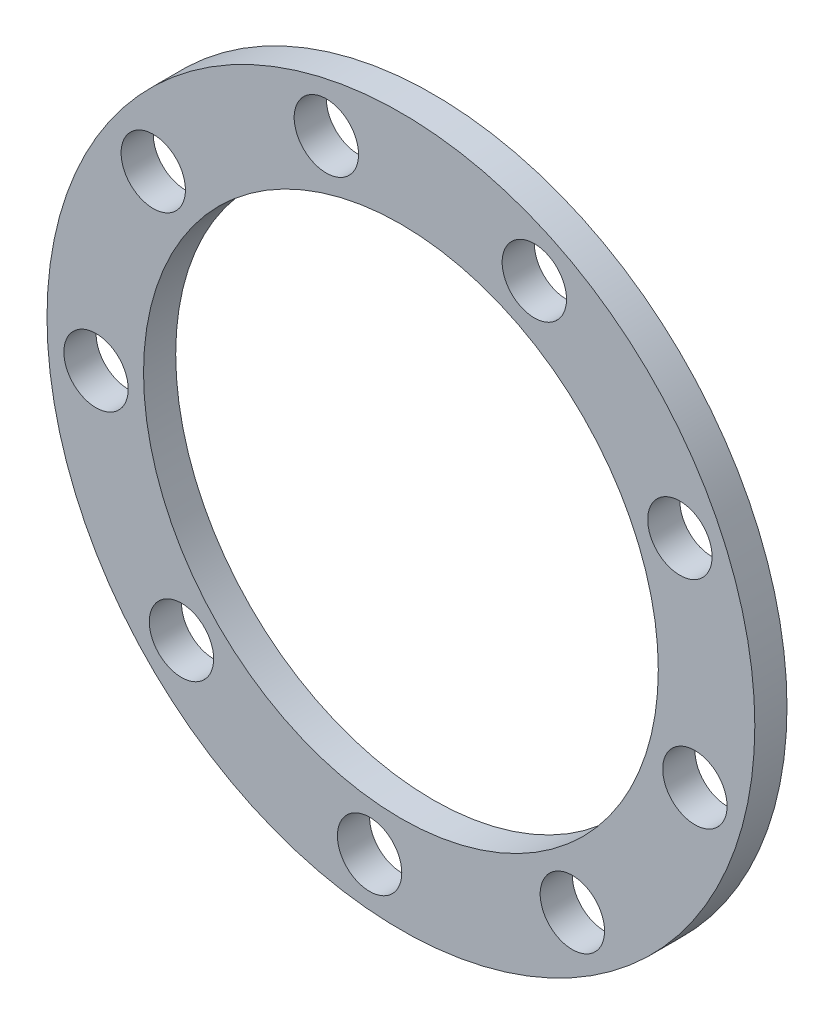
ISO-10303-21;
HEADER;
FILE_DESCRIPTION(('STEP AP214'),'2;1');
FILE_NAME('part.step','',(''),(''),'','','');
FILE_SCHEMA(('AUTOMOTIVE_DESIGN { 1 0 10303 214 1 1 1 1 }'));
ENDSEC;
DATA;
#1=APPLICATION_CONTEXT('core data for automotive mechanical design processes');
#2=APPLICATION_PROTOCOL_DEFINITION('international standard','automotive_design',2000,#1);
#3=PRODUCT_CONTEXT('',#1,'mechanical');
#4=PRODUCT('Part','Part','',(#3));
#5=PRODUCT_RELATED_PRODUCT_CATEGORY('part','',(#4));
#6=PRODUCT_DEFINITION_FORMATION('','',#4);
#7=PRODUCT_DEFINITION_CONTEXT('part definition',#1,'design');
#8=PRODUCT_DEFINITION('design','',#6,#7);
#9=PRODUCT_DEFINITION_SHAPE('','',#8);
#10=(LENGTH_UNIT() NAMED_UNIT(*) SI_UNIT(.MILLI.,.METRE.));
#11=(NAMED_UNIT(*) PLANE_ANGLE_UNIT() SI_UNIT($,.RADIAN.));
#12=(NAMED_UNIT(*) SI_UNIT($,.STERADIAN.) SOLID_ANGLE_UNIT());
#13=UNCERTAINTY_MEASURE_WITH_UNIT(LENGTH_MEASURE(1.E-05),#10,'distance_accuracy_value','');
#14=(GEOMETRIC_REPRESENTATION_CONTEXT(3) GLOBAL_UNCERTAINTY_ASSIGNED_CONTEXT((#13)) GLOBAL_UNIT_ASSIGNED_CONTEXT((#10,
#11,#12)) REPRESENTATION_CONTEXT('',''));
#15=CARTESIAN_POINT('',(0.,0.,0.));
#16=DIRECTION('',(0.,0.,1.));
#17=DIRECTION('',(1.,0.,0.));
#18=AXIS2_PLACEMENT_3D('',#15,#16,#17);
#19=CARTESIAN_POINT('',(0.,0.,1.));
#20=DIRECTION('',(0.,0.,1.));
#21=DIRECTION('',(1.,0.,0.));
#22=AXIS2_PLACEMENT_3D('',#19,#20,#21);
#23=PLANE('',#22);
#24=CARTESIAN_POINT('',(-9.47547630305742,-0.682164811595904,1.));
#25=DIRECTION('',(0.,0.,1.));
#26=DIRECTION('',(1.,0.,0.));
#27=AXIS2_PLACEMENT_3D('',#24,#25,#26);
#28=CIRCLE('',#27,1.00000000000093);
#29=CARTESIAN_POINT('',(-8.47547630305649,-0.682164811595904,1.));
#30=VERTEX_POINT('',#29);
#31=EDGE_CURVE('E91',#30,#30,#28,.T.);
#32=ORIENTED_EDGE('',*,*,#31,.F.);
#33=EDGE_LOOP('',(#32));
#34=FACE_BOUND('',#33,.T.);
#35=CARTESIAN_POINT('',(-0.973597997259366,-9.44997920313724,1.));
#36=DIRECTION('',(0.,0.,1.));
#37=DIRECTION('',(1.,0.,0.));
#38=AXIS2_PLACEMENT_3D('',#35,#36,#37);
#39=CIRCLE('',#38,1.00000000000192);
#40=CARTESIAN_POINT('',(0.0264020027425509,-9.44997920313724,1.));
#41=VERTEX_POINT('',#40);
#42=EDGE_CURVE('E79',#41,#41,#39,.T.);
#43=ORIENTED_EDGE('',*,*,#42,.F.);
#44=EDGE_LOOP('',(#43));
#45=FACE_BOUND('',#44,.T.);
#46=CARTESIAN_POINT('',(9.13734926705041,-2.59977852363407,1.));
#47=DIRECTION('',(0.,0.,1.));
#48=DIRECTION('',(1.,0.,0.));
#49=AXIS2_PLACEMENT_3D('',#46,#47,#48);
#50=CIRCLE('',#49,1.00000000000142);
#51=CARTESIAN_POINT('',(10.1373492670518,-2.59977852363407,1.));
#52=VERTEX_POINT('',#51);
#53=EDGE_CURVE('E67',#52,#52,#50,.T.);
#54=ORIENTED_EDGE('',*,*,#53,.F.);
#55=EDGE_LOOP('',(#54));
#56=FACE_BOUND('',#55,.T.);
#57=CARTESIAN_POINT('',(4.14696609512001,8.54708559720427,1.));
#58=DIRECTION('',(0.,0.,1.));
#59=DIRECTION('',(1.,0.,0.));
#60=AXIS2_PLACEMENT_3D('',#57,#58,#59);
#61=CIRCLE('',#60,1.0000000000002);
#62=CARTESIAN_POINT('',(5.14696609512021,8.54708559720427,1.));
#63=VERTEX_POINT('',#62);
#64=EDGE_CURVE('E55',#63,#63,#61,.T.);
#65=ORIENTED_EDGE('',*,*,#64,.F.);
#66=EDGE_LOOP('',(#65));
#67=FACE_BOUND('',#66,.T.);
#68=CARTESIAN_POINT('',(0.,0.,1.));
#69=DIRECTION('',(0.,0.,1.));
#70=DIRECTION('',(1.,0.,0.));
#71=AXIS2_PLACEMENT_3D('',#68,#69,#70);
#72=CIRCLE('',#71,8.);
#73=CARTESIAN_POINT('',(8.,0.,1.));
#74=VERTEX_POINT('',#73);
#75=EDGE_CURVE('E44',#74,#74,#72,.T.);
#76=ORIENTED_EDGE('',*,*,#75,.F.);
#77=EDGE_LOOP('',(#76));
#78=FACE_BOUND('',#77,.T.);
#79=CARTESIAN_POINT('',(0.,0.,1.));
#80=DIRECTION('',(0.,0.,1.));
#81=DIRECTION('',(1.,0.,0.));
#82=AXIS2_PLACEMENT_3D('',#79,#80,#81);
#83=CIRCLE('',#82,11.);
#84=CARTESIAN_POINT('',(11.,0.,1.));
#85=VERTEX_POINT('',#84);
#86=EDGE_CURVE('E10',#85,#85,#83,.T.);
#87=ORIENTED_EDGE('',*,*,#86,.T.);
#88=EDGE_LOOP('',(#87));
#89=FACE_BOUND('',#88,.T.);
#90=CARTESIAN_POINT('',(-2.31720038784333,9.21306585033336,1.));
#91=DIRECTION('',(0.,0.,1.));
#92=DIRECTION('',(1.,0.,0.));
#93=AXIS2_PLACEMENT_3D('',#90,#91,#92);
#94=CIRCLE('',#93,1.);
#95=CARTESIAN_POINT('',(-1.31720038784333,9.21306585033336,1.));
#96=VERTEX_POINT('',#95);
#97=EDGE_CURVE('E49',#96,#96,#94,.T.);
#98=ORIENTED_EDGE('',*,*,#97,.F.);
#99=EDGE_LOOP('',(#98));
#100=FACE_BOUND('',#99,.T.);
#101=CARTESIAN_POINT('',(8.67072105378274,3.88182900286791,1.));
#102=DIRECTION('',(0.,0.,1.));
#103=DIRECTION('',(1.,0.,0.));
#104=AXIS2_PLACEMENT_3D('',#101,#102,#103);
#105=CIRCLE('',#104,1.00000000000076);
#106=CARTESIAN_POINT('',(9.6707210537835,3.88182900286791,1.));
#107=VERTEX_POINT('',#106);
#108=EDGE_CURVE('E61',#107,#107,#105,.T.);
#109=ORIENTED_EDGE('',*,*,#108,.F.);
#110=EDGE_LOOP('',(#109));
#111=FACE_BOUND('',#110,.T.);
#112=CARTESIAN_POINT('',(5.32851020794016,-7.86492078560768,1.));
#113=DIRECTION('',(0.,0.,1.));
#114=DIRECTION('',(1.,0.,0.));
#115=AXIS2_PLACEMENT_3D('',#112,#113,#114);
#116=CIRCLE('',#115,1.00000000000187);
#117=CARTESIAN_POINT('',(6.32851020794203,-7.86492078560768,1.));
#118=VERTEX_POINT('',#117);
#119=EDGE_CURVE('E73',#118,#118,#116,.T.);
#120=ORIENTED_EDGE('',*,*,#119,.F.);
#121=EDGE_LOOP('',(#120));
#122=FACE_BOUND('',#121,.T.);
#123=CARTESIAN_POINT('',(-6.82014887920433,-6.61328732669861,1.));
#124=DIRECTION('',(0.,0.,1.));
#125=DIRECTION('',(1.,0.,0.));
#126=AXIS2_PLACEMENT_3D('',#123,#124,#125);
#127=CIRCLE('',#126,1.00000000000155);
#128=CARTESIAN_POINT('',(-5.82014887920278,-6.61328732669861,1.));
#129=VERTEX_POINT('',#128);
#130=EDGE_CURVE('E85',#129,#129,#127,.T.);
#131=ORIENTED_EDGE('',*,*,#130,.F.);
#132=EDGE_LOOP('',(#131));
#133=FACE_BOUND('',#132,.T.);
#134=CARTESIAN_POINT('',(-7.69712305652062,5.56815020027002,1.));
#135=DIRECTION('',(0.,0.,1.));
#136=DIRECTION('',(1.,0.,0.));
#137=AXIS2_PLACEMENT_3D('',#134,#135,#136);
#138=CIRCLE('',#137,1.00000000000037);
#139=CARTESIAN_POINT('',(-6.69712305652025,5.56815020027002,1.));
#140=VERTEX_POINT('',#139);
#141=EDGE_CURVE('E97',#140,#140,#138,.T.);
#142=ORIENTED_EDGE('',*,*,#141,.F.);
#143=EDGE_LOOP('',(#142));
#144=FACE_BOUND('',#143,.T.);
#145=ADVANCED_FACE('F33',(#34,#45,#56,#67,#78,#89,#100,#111,#122,#133,#144),#23,.T.);
#146=CARTESIAN_POINT('',(0.,0.,0.));
#147=DIRECTION('',(0.,0.,1.));
#148=DIRECTION('',(1.,0.,0.));
#149=AXIS2_PLACEMENT_3D('',#146,#147,#148);
#150=PLANE('',#149);
#151=CARTESIAN_POINT('',(0.,0.,0.));
#152=DIRECTION('',(0.,0.,1.));
#153=DIRECTION('',(1.,0.,0.));
#154=AXIS2_PLACEMENT_3D('',#151,#152,#153);
#155=CIRCLE('',#154,11.);
#156=CARTESIAN_POINT('',(11.,0.,0.));
#157=VERTEX_POINT('',#156);
#158=EDGE_CURVE('E37',#157,#157,#155,.T.);
#159=ORIENTED_EDGE('',*,*,#158,.F.);
#160=EDGE_LOOP('',(#159));
#161=FACE_BOUND('',#160,.T.);
#162=CARTESIAN_POINT('',(0.,0.,0.));
#163=DIRECTION('',(0.,0.,1.));
#164=DIRECTION('',(1.,0.,0.));
#165=AXIS2_PLACEMENT_3D('',#162,#163,#164);
#166=CIRCLE('',#165,8.);
#167=CARTESIAN_POINT('',(8.,0.,0.));
#168=VERTEX_POINT('',#167);
#169=EDGE_CURVE('E46',#168,#168,#166,.T.);
#170=ORIENTED_EDGE('',*,*,#169,.T.);
#171=EDGE_LOOP('',(#170));
#172=FACE_BOUND('',#171,.T.);
#173=CARTESIAN_POINT('',(-2.31720038784333,9.21306585033336,0.));
#174=DIRECTION('',(0.,0.,1.));
#175=DIRECTION('',(1.,0.,0.));
#176=AXIS2_PLACEMENT_3D('',#173,#174,#175);
#177=CIRCLE('',#176,1.);
#178=CARTESIAN_POINT('',(-1.31720038784333,9.21306585033336,0.));
#179=VERTEX_POINT('',#178);
#180=EDGE_CURVE('E52',#179,#179,#177,.T.);
#181=ORIENTED_EDGE('',*,*,#180,.T.);
#182=EDGE_LOOP('',(#181));
#183=FACE_BOUND('',#182,.T.);
#184=CARTESIAN_POINT('',(4.14696609512001,8.54708559720427,0.));
#185=DIRECTION('',(0.,0.,1.));
#186=DIRECTION('',(1.,0.,0.));
#187=AXIS2_PLACEMENT_3D('',#184,#185,#186);
#188=CIRCLE('',#187,1.0000000000002);
#189=CARTESIAN_POINT('',(5.14696609512021,8.54708559720427,0.));
#190=VERTEX_POINT('',#189);
#191=EDGE_CURVE('E58',#190,#190,#188,.T.);
#192=ORIENTED_EDGE('',*,*,#191,.T.);
#193=EDGE_LOOP('',(#192));
#194=FACE_BOUND('',#193,.T.);
#195=CARTESIAN_POINT('',(8.67072105378274,3.88182900286791,0.));
#196=DIRECTION('',(0.,0.,1.));
#197=DIRECTION('',(1.,0.,0.));
#198=AXIS2_PLACEMENT_3D('',#195,#196,#197);
#199=CIRCLE('',#198,1.00000000000076);
#200=CARTESIAN_POINT('',(9.6707210537835,3.88182900286791,0.));
#201=VERTEX_POINT('',#200);
#202=EDGE_CURVE('E64',#201,#201,#199,.T.);
#203=ORIENTED_EDGE('',*,*,#202,.T.);
#204=EDGE_LOOP('',(#203));
#205=FACE_BOUND('',#204,.T.);
#206=CARTESIAN_POINT('',(9.13734926705041,-2.59977852363407,0.));
#207=DIRECTION('',(0.,0.,1.));
#208=DIRECTION('',(1.,0.,0.));
#209=AXIS2_PLACEMENT_3D('',#206,#207,#208);
#210=CIRCLE('',#209,1.00000000000142);
#211=CARTESIAN_POINT('',(10.1373492670518,-2.59977852363407,0.));
#212=VERTEX_POINT('',#211);
#213=EDGE_CURVE('E70',#212,#212,#210,.T.);
#214=ORIENTED_EDGE('',*,*,#213,.T.);
#215=EDGE_LOOP('',(#214));
#216=FACE_BOUND('',#215,.T.);
#217=CARTESIAN_POINT('',(5.32851020794016,-7.86492078560768,0.));
#218=DIRECTION('',(0.,0.,1.));
#219=DIRECTION('',(1.,0.,0.));
#220=AXIS2_PLACEMENT_3D('',#217,#218,#219);
#221=CIRCLE('',#220,1.00000000000187);
#222=CARTESIAN_POINT('',(6.32851020794203,-7.86492078560768,0.));
#223=VERTEX_POINT('',#222);
#224=EDGE_CURVE('E76',#223,#223,#221,.T.);
#225=ORIENTED_EDGE('',*,*,#224,.T.);
#226=EDGE_LOOP('',(#225));
#227=FACE_BOUND('',#226,.T.);
#228=CARTESIAN_POINT('',(-0.973597997259366,-9.44997920313724,0.));
#229=DIRECTION('',(0.,0.,1.));
#230=DIRECTION('',(1.,0.,0.));
#231=AXIS2_PLACEMENT_3D('',#228,#229,#230);
#232=CIRCLE('',#231,1.00000000000192);
#233=CARTESIAN_POINT('',(0.0264020027425509,-9.44997920313724,0.));
#234=VERTEX_POINT('',#233);
#235=EDGE_CURVE('E82',#234,#234,#232,.T.);
#236=ORIENTED_EDGE('',*,*,#235,.T.);
#237=EDGE_LOOP('',(#236));
#238=FACE_BOUND('',#237,.T.);
#239=CARTESIAN_POINT('',(-6.82014887920433,-6.61328732669861,0.));
#240=DIRECTION('',(0.,0.,1.));
#241=DIRECTION('',(1.,0.,0.));
#242=AXIS2_PLACEMENT_3D('',#239,#240,#241);
#243=CIRCLE('',#242,1.00000000000155);
#244=CARTESIAN_POINT('',(-5.82014887920278,-6.61328732669861,0.));
#245=VERTEX_POINT('',#244);
#246=EDGE_CURVE('E88',#245,#245,#243,.T.);
#247=ORIENTED_EDGE('',*,*,#246,.T.);
#248=EDGE_LOOP('',(#247));
#249=FACE_BOUND('',#248,.T.);
#250=CARTESIAN_POINT('',(-9.47547630305742,-0.682164811595904,0.));
#251=DIRECTION('',(0.,0.,1.));
#252=DIRECTION('',(1.,0.,0.));
#253=AXIS2_PLACEMENT_3D('',#250,#251,#252);
#254=CIRCLE('',#253,1.00000000000093);
#255=CARTESIAN_POINT('',(-8.47547630305649,-0.682164811595904,0.));
#256=VERTEX_POINT('',#255);
#257=EDGE_CURVE('E94',#256,#256,#254,.T.);
#258=ORIENTED_EDGE('',*,*,#257,.T.);
#259=EDGE_LOOP('',(#258));
#260=FACE_BOUND('',#259,.T.);
#261=CARTESIAN_POINT('',(-7.69712305652062,5.56815020027002,0.));
#262=DIRECTION('',(0.,0.,1.));
#263=DIRECTION('',(1.,0.,0.));
#264=AXIS2_PLACEMENT_3D('',#261,#262,#263);
#265=CIRCLE('',#264,1.00000000000037);
#266=CARTESIAN_POINT('',(-6.69712305652025,5.56815020027002,0.));
#267=VERTEX_POINT('',#266);
#268=EDGE_CURVE('E100',#267,#267,#265,.T.);
#269=ORIENTED_EDGE('',*,*,#268,.T.);
#270=EDGE_LOOP('',(#269));
#271=FACE_BOUND('',#270,.T.);
#272=ADVANCED_FACE('F110',(#161,#172,#183,#194,#205,#216,#227,#238,#249,#260,#271),#150,.F.);
#273=CARTESIAN_POINT('',(0.,0.,1.));
#274=DIRECTION('',(0.,0.,-1.));
#275=DIRECTION('',(-1.,0.,0.));
#276=AXIS2_PLACEMENT_3D('',#273,#274,#275);
#277=CYLINDRICAL_SURFACE('',#276,11.);
#278=ORIENTED_EDGE('',*,*,#86,.F.);
#279=EDGE_LOOP('',(#278));
#280=FACE_BOUND('',#279,.T.);
#281=ORIENTED_EDGE('',*,*,#158,.T.);
#282=EDGE_LOOP('',(#281));
#283=FACE_BOUND('',#282,.T.);
#284=ADVANCED_FACE('F35',(#280,#283),#277,.T.);
#285=CARTESIAN_POINT('',(0.,0.,1.));
#286=DIRECTION('',(0.,0.,-1.));
#287=DIRECTION('',(-1.,0.,0.));
#288=AXIS2_PLACEMENT_3D('',#285,#286,#287);
#289=CYLINDRICAL_SURFACE('',#288,8.);
#290=ORIENTED_EDGE('',*,*,#75,.T.);
#291=EDGE_LOOP('',(#290));
#292=FACE_BOUND('',#291,.T.);
#293=ORIENTED_EDGE('',*,*,#169,.F.);
#294=EDGE_LOOP('',(#293));
#295=FACE_BOUND('',#294,.T.);
#296=ADVANCED_FACE('F120',(#292,#295),#289,.F.);
#297=CARTESIAN_POINT('',(-2.31720038784333,9.21306585033336,1.));
#298=DIRECTION('',(0.,0.,-1.));
#299=DIRECTION('',(-1.,0.,0.));
#300=AXIS2_PLACEMENT_3D('',#297,#298,#299);
#301=CYLINDRICAL_SURFACE('',#300,1.);
#302=ORIENTED_EDGE('',*,*,#97,.T.);
#303=EDGE_LOOP('',(#302));
#304=FACE_BOUND('',#303,.T.);
#305=ORIENTED_EDGE('',*,*,#180,.F.);
#306=EDGE_LOOP('',(#305));
#307=FACE_BOUND('',#306,.T.);
#308=ADVANCED_FACE('F123',(#304,#307),#301,.F.);
#309=CARTESIAN_POINT('',(4.14696609512001,8.54708559720427,1.));
#310=DIRECTION('',(0.,0.,-1.));
#311=DIRECTION('',(-1.,0.,0.));
#312=AXIS2_PLACEMENT_3D('',#309,#310,#311);
#313=CYLINDRICAL_SURFACE('',#312,1.0000000000002);
#314=ORIENTED_EDGE('',*,*,#64,.T.);
#315=EDGE_LOOP('',(#314));
#316=FACE_BOUND('',#315,.T.);
#317=ORIENTED_EDGE('',*,*,#191,.F.);
#318=EDGE_LOOP('',(#317));
#319=FACE_BOUND('',#318,.T.);
#320=ADVANCED_FACE('F127',(#316,#319),#313,.F.);
#321=CARTESIAN_POINT('',(8.67072105378274,3.88182900286791,1.));
#322=DIRECTION('',(0.,0.,-1.));
#323=DIRECTION('',(-1.,0.,0.));
#324=AXIS2_PLACEMENT_3D('',#321,#322,#323);
#325=CYLINDRICAL_SURFACE('',#324,1.00000000000076);
#326=ORIENTED_EDGE('',*,*,#108,.T.);
#327=EDGE_LOOP('',(#326));
#328=FACE_BOUND('',#327,.T.);
#329=ORIENTED_EDGE('',*,*,#202,.F.);
#330=EDGE_LOOP('',(#329));
#331=FACE_BOUND('',#330,.T.);
#332=ADVANCED_FACE('F131',(#328,#331),#325,.F.);
#333=CARTESIAN_POINT('',(9.13734926705041,-2.59977852363407,1.));
#334=DIRECTION('',(0.,0.,-1.));
#335=DIRECTION('',(-1.,0.,0.));
#336=AXIS2_PLACEMENT_3D('',#333,#334,#335);
#337=CYLINDRICAL_SURFACE('',#336,1.00000000000142);
#338=ORIENTED_EDGE('',*,*,#53,.T.);
#339=EDGE_LOOP('',(#338));
#340=FACE_BOUND('',#339,.T.);
#341=ORIENTED_EDGE('',*,*,#213,.F.);
#342=EDGE_LOOP('',(#341));
#343=FACE_BOUND('',#342,.T.);
#344=ADVANCED_FACE('F135',(#340,#343),#337,.F.);
#345=CARTESIAN_POINT('',(5.32851020794016,-7.86492078560768,1.));
#346=DIRECTION('',(0.,0.,-1.));
#347=DIRECTION('',(-1.,0.,0.));
#348=AXIS2_PLACEMENT_3D('',#345,#346,#347);
#349=CYLINDRICAL_SURFACE('',#348,1.00000000000187);
#350=ORIENTED_EDGE('',*,*,#119,.T.);
#351=EDGE_LOOP('',(#350));
#352=FACE_BOUND('',#351,.T.);
#353=ORIENTED_EDGE('',*,*,#224,.F.);
#354=EDGE_LOOP('',(#353));
#355=FACE_BOUND('',#354,.T.);
#356=ADVANCED_FACE('F139',(#352,#355),#349,.F.);
#357=CARTESIAN_POINT('',(-0.973597997259366,-9.44997920313724,1.));
#358=DIRECTION('',(0.,0.,-1.));
#359=DIRECTION('',(-1.,0.,0.));
#360=AXIS2_PLACEMENT_3D('',#357,#358,#359);
#361=CYLINDRICAL_SURFACE('',#360,1.00000000000192);
#362=ORIENTED_EDGE('',*,*,#42,.T.);
#363=EDGE_LOOP('',(#362));
#364=FACE_BOUND('',#363,.T.);
#365=ORIENTED_EDGE('',*,*,#235,.F.);
#366=EDGE_LOOP('',(#365));
#367=FACE_BOUND('',#366,.T.);
#368=ADVANCED_FACE('F143',(#364,#367),#361,.F.);
#369=CARTESIAN_POINT('',(-6.82014887920433,-6.61328732669861,1.));
#370=DIRECTION('',(0.,0.,-1.));
#371=DIRECTION('',(-1.,0.,0.));
#372=AXIS2_PLACEMENT_3D('',#369,#370,#371);
#373=CYLINDRICAL_SURFACE('',#372,1.00000000000155);
#374=ORIENTED_EDGE('',*,*,#130,.T.);
#375=EDGE_LOOP('',(#374));
#376=FACE_BOUND('',#375,.T.);
#377=ORIENTED_EDGE('',*,*,#246,.F.);
#378=EDGE_LOOP('',(#377));
#379=FACE_BOUND('',#378,.T.);
#380=ADVANCED_FACE('F147',(#376,#379),#373,.F.);
#381=CARTESIAN_POINT('',(-9.47547630305742,-0.682164811595904,1.));
#382=DIRECTION('',(0.,0.,-1.));
#383=DIRECTION('',(-1.,0.,0.));
#384=AXIS2_PLACEMENT_3D('',#381,#382,#383);
#385=CYLINDRICAL_SURFACE('',#384,1.00000000000093);
#386=ORIENTED_EDGE('',*,*,#31,.T.);
#387=EDGE_LOOP('',(#386));
#388=FACE_BOUND('',#387,.T.);
#389=ORIENTED_EDGE('',*,*,#257,.F.);
#390=EDGE_LOOP('',(#389));
#391=FACE_BOUND('',#390,.T.);
#392=ADVANCED_FACE('F151',(#388,#391),#385,.F.);
#393=CARTESIAN_POINT('',(-7.69712305652062,5.56815020027002,1.));
#394=DIRECTION('',(0.,0.,-1.));
#395=DIRECTION('',(-1.,0.,0.));
#396=AXIS2_PLACEMENT_3D('',#393,#394,#395);
#397=CYLINDRICAL_SURFACE('',#396,1.00000000000037);
#398=ORIENTED_EDGE('',*,*,#141,.T.);
#399=EDGE_LOOP('',(#398));
#400=FACE_BOUND('',#399,.T.);
#401=ORIENTED_EDGE('',*,*,#268,.F.);
#402=EDGE_LOOP('',(#401));
#403=FACE_BOUND('',#402,.T.);
#404=ADVANCED_FACE('F106',(#400,#403),#397,.F.);
#405=CLOSED_SHELL('',(#145,#272,#284,#296,#308,#320,#332,#344,#356,#368,#380,#392,#404));
#406=MANIFOLD_SOLID_BREP('B2',#405);
#407=ADVANCED_BREP_SHAPE_REPRESENTATION('',(#18,#406),#14);
#408=SHAPE_DEFINITION_REPRESENTATION(#9,#407);
ENDSEC;
END-ISO-10303-21;
